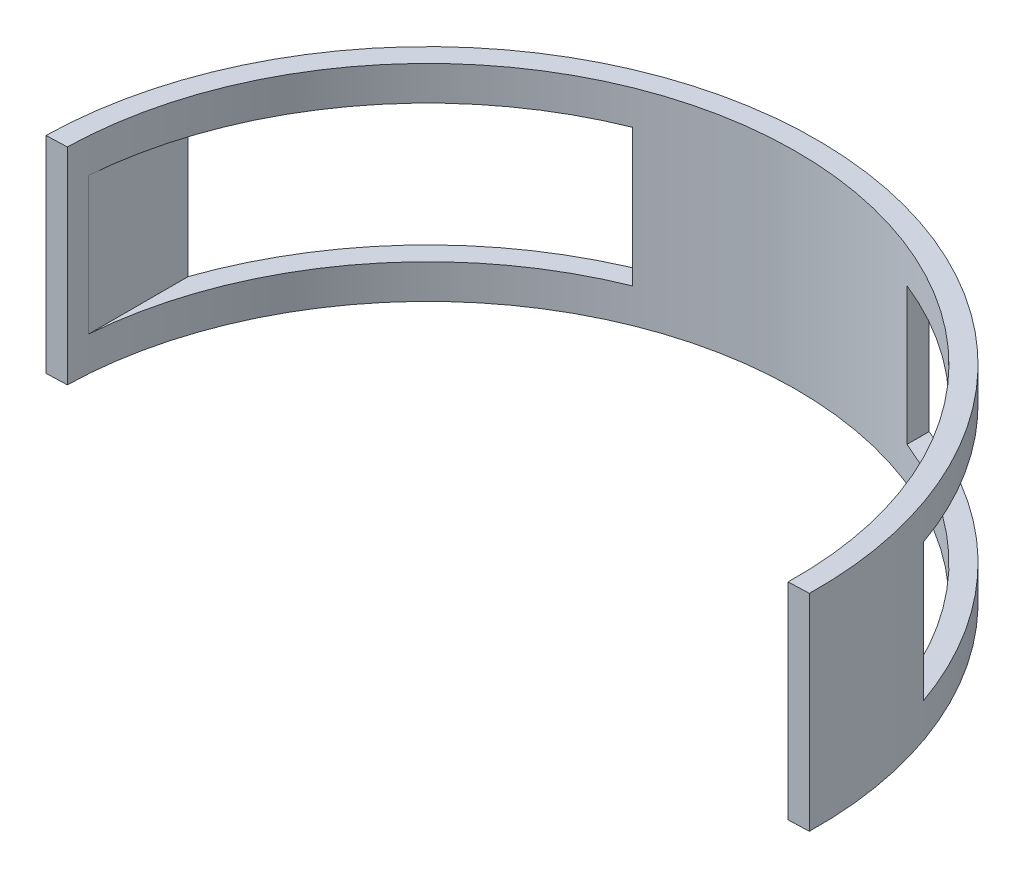
ISO-10303-21;
HEADER;
FILE_DESCRIPTION(('STEP AP214'),'2;1');
FILE_NAME('part.step','',(''),(''),'','','');
FILE_SCHEMA(('AUTOMOTIVE_DESIGN { 1 0 10303 214 1 1 1 1 }'));
ENDSEC;
DATA;
#1=APPLICATION_CONTEXT('core data for automotive mechanical design processes');
#2=APPLICATION_PROTOCOL_DEFINITION('international standard','automotive_design',2000,#1);
#3=PRODUCT_CONTEXT('',#1,'mechanical');
#4=PRODUCT('Part','Part','',(#3));
#5=PRODUCT_RELATED_PRODUCT_CATEGORY('part','',(#4));
#6=PRODUCT_DEFINITION_FORMATION('','',#4);
#7=PRODUCT_DEFINITION_CONTEXT('part definition',#1,'design');
#8=PRODUCT_DEFINITION('design','',#6,#7);
#9=PRODUCT_DEFINITION_SHAPE('','',#8);
#10=(LENGTH_UNIT() NAMED_UNIT(*) SI_UNIT(.MILLI.,.METRE.));
#11=(NAMED_UNIT(*) PLANE_ANGLE_UNIT() SI_UNIT($,.RADIAN.));
#12=(NAMED_UNIT(*) SI_UNIT($,.STERADIAN.) SOLID_ANGLE_UNIT());
#13=UNCERTAINTY_MEASURE_WITH_UNIT(LENGTH_MEASURE(1.E-05),#10,'distance_accuracy_value','');
#14=(GEOMETRIC_REPRESENTATION_CONTEXT(3) GLOBAL_UNCERTAINTY_ASSIGNED_CONTEXT((#13)) GLOBAL_UNIT_ASSIGNED_CONTEXT((#10,
#11,#12)) REPRESENTATION_CONTEXT('',''));
#15=CARTESIAN_POINT('',(0.,0.,0.));
#16=DIRECTION('',(0.,0.,1.));
#17=DIRECTION('',(1.,0.,0.));
#18=AXIS2_PLACEMENT_3D('',#15,#16,#17);
#19=CARTESIAN_POINT('',(0.,15.,0.));
#20=DIRECTION('',(0.,-1.,0.));
#21=DIRECTION('',(0.,0.,-1.));
#22=AXIS2_PLACEMENT_3D('',#19,#20,#21);
#23=CYLINDRICAL_SURFACE('',#22,56.6555359957958);
#24=CARTESIAN_POINT('',(0.,10.,0.));
#25=DIRECTION('',(0.,1.,0.));
#26=DIRECTION('',(-1.,0.,0.));
#27=AXIS2_PLACEMENT_3D('',#24,#25,#26);
#28=CIRCLE('',#27,56.6555359957958);
#29=CARTESIAN_POINT('',(-19.9754881219371,10.,-53.0172578813848));
#30=VERTEX_POINT('',#29);
#31=CARTESIAN_POINT('',(-53.5,10.,-18.6440274342995));
#32=VERTEX_POINT('',#31);
#33=EDGE_CURVE('E167',#30,#32,#28,.T.);
#34=ORIENTED_EDGE('',*,*,#33,.T.);
#35=DIRECTION('',(0.,-1.,0.));
#36=VECTOR('',#35,1.);
#37=CARTESIAN_POINT('',(-53.5,15.,-18.6440274342995));
#38=LINE('',#37,#36);
#39=CARTESIAN_POINT('',(-53.5,-10.,-18.6440274342995));
#40=VERTEX_POINT('',#39);
#41=EDGE_CURVE('E171',#32,#40,#38,.T.);
#42=ORIENTED_EDGE('',*,*,#41,.T.);
#43=CARTESIAN_POINT('',(0.,-10.,0.));
#44=DIRECTION('',(0.,-1.,0.));
#45=DIRECTION('',(0.,0.,-1.));
#46=AXIS2_PLACEMENT_3D('',#43,#44,#45);
#47=CIRCLE('',#46,56.6555359957958);
#48=CARTESIAN_POINT('',(-19.9754881219371,-10.,-53.0172578813848));
#49=VERTEX_POINT('',#48);
#50=EDGE_CURVE('E154',#40,#49,#47,.T.);
#51=ORIENTED_EDGE('',*,*,#50,.T.);
#52=DIRECTION('',(0.,-1.,0.));
#53=VECTOR('',#52,1.);
#54=CARTESIAN_POINT('',(-19.9754881219371,15.,-53.0172578813848));
#55=LINE('',#54,#53);
#56=EDGE_CURVE('E159',#49,#30,#55,.F.);
#57=ORIENTED_EDGE('',*,*,#56,.T.);
#58=EDGE_LOOP('',(#34,#42,#51,#57));
#59=FACE_BOUND('',#58,.T.);
#60=DIRECTION('',(0.,-1.,0.));
#61=VECTOR('',#60,1.);
#62=CARTESIAN_POINT('',(53.5,15.,-18.6440274342994));
#63=LINE('',#62,#61);
#64=CARTESIAN_POINT('',(53.5,-10.,-18.6440274342994));
#65=VERTEX_POINT('',#64);
#66=CARTESIAN_POINT('',(53.5,10.,-18.6440274342994));
#67=VERTEX_POINT('',#66);
#68=EDGE_CURVE('E152',#65,#67,#63,.F.);
#69=ORIENTED_EDGE('',*,*,#68,.T.);
#70=CARTESIAN_POINT('',(0.,10.,0.));
#71=DIRECTION('',(0.,1.,0.));
#72=DIRECTION('',(-1.,0.,0.));
#73=AXIS2_PLACEMENT_3D('',#70,#71,#72);
#74=CIRCLE('',#73,56.6555359957958);
#75=CARTESIAN_POINT('',(19.9754881219371,10.,-53.0172578813848));
#76=VERTEX_POINT('',#75);
#77=EDGE_CURVE('E143',#67,#76,#74,.T.);
#78=ORIENTED_EDGE('',*,*,#77,.T.);
#79=DIRECTION('',(0.,-1.,0.));
#80=VECTOR('',#79,1.);
#81=CARTESIAN_POINT('',(19.9754881219371,15.,-53.0172578813848));
#82=LINE('',#81,#80);
#83=CARTESIAN_POINT('',(19.9754881219371,-10.,-53.0172578813848));
#84=VERTEX_POINT('',#83);
#85=EDGE_CURVE('E128',#76,#84,#82,.T.);
#86=ORIENTED_EDGE('',*,*,#85,.T.);
#87=CARTESIAN_POINT('',(0.,-10.,0.));
#88=DIRECTION('',(0.,-1.,0.));
#89=DIRECTION('',(0.,0.,-1.));
#90=AXIS2_PLACEMENT_3D('',#87,#88,#89);
#91=CIRCLE('',#90,56.6555359957958);
#92=EDGE_CURVE('E137',#84,#65,#91,.T.);
#93=ORIENTED_EDGE('',*,*,#92,.T.);
#94=EDGE_LOOP('',(#69,#78,#86,#93));
#95=FACE_BOUND('',#94,.T.);
#96=CARTESIAN_POINT('',(0.,-15.,0.));
#97=DIRECTION('',(0.,1.,0.));
#98=DIRECTION('',(0.,0.,1.));
#99=AXIS2_PLACEMENT_3D('',#96,#97,#98);
#100=CIRCLE('',#99,56.6555359957958);
#101=CARTESIAN_POINT('',(56.6451469113242,-15.,1.0849379546368));
#102=VERTEX_POINT('',#101);
#103=CARTESIAN_POINT('',(-56.6451423998593,-15.,-1.08517347487532));
#104=VERTEX_POINT('',#103);
#105=EDGE_CURVE('E175',#102,#104,#100,.T.);
#106=ORIENTED_EDGE('',*,*,#105,.T.);
#107=DIRECTION('',(0.,-1.,0.));
#108=VECTOR('',#107,1.);
#109=CARTESIAN_POINT('',(-56.6451423998593,15.,-1.08517347487532));
#110=LINE('',#109,#108);
#111=CARTESIAN_POINT('',(-56.6451423998593,15.,-1.08517347487532));
#112=VERTEX_POINT('',#111);
#113=EDGE_CURVE('E213',#112,#104,#110,.T.);
#114=ORIENTED_EDGE('',*,*,#113,.F.);
#115=CARTESIAN_POINT('',(0.,15.,0.));
#116=DIRECTION('',(0.,1.,0.));
#117=DIRECTION('',(0.,0.,1.));
#118=AXIS2_PLACEMENT_3D('',#115,#116,#117);
#119=CIRCLE('',#118,56.6555359957958);
#120=CARTESIAN_POINT('',(56.6451469113242,15.,1.0849379546368));
#121=VERTEX_POINT('',#120);
#122=EDGE_CURVE('E176',#121,#112,#119,.T.);
#123=ORIENTED_EDGE('',*,*,#122,.F.);
#124=DIRECTION('',(0.,-1.,0.));
#125=VECTOR('',#124,1.);
#126=CARTESIAN_POINT('',(56.6451469113242,15.,1.0849379546368));
#127=LINE('',#126,#125);
#128=EDGE_CURVE('E190',#121,#102,#127,.T.);
#129=ORIENTED_EDGE('',*,*,#128,.T.);
#130=EDGE_LOOP('',(#106,#114,#123,#129));
#131=FACE_BOUND('',#130,.T.);
#132=ADVANCED_FACE('F41',(#59,#95,#131),#23,.T.);
#133=CARTESIAN_POINT('',(-56.6451423998593,15.,-1.08517347487532));
#134=DIRECTION('',(-0.0338603424814454,0.,-0.999426574194943));
#135=DIRECTION('',(-0.999426574194943,0.,0.0338603424814454));
#136=AXIS2_PLACEMENT_3D('',#133,#134,#135);
#137=PLANE('',#136);
#138=DIRECTION('',(0.999426574194943,0.,-0.0338603424814454));
#139=VECTOR('',#138,1.);
#140=CARTESIAN_POINT('',(-56.6451423998593,-15.,-1.08517347487532));
#141=LINE('',#140,#139);
#142=CARTESIAN_POINT('',(-53.6468751630069,-15.,-1.18675407930591));
#143=VERTEX_POINT('',#142);
#144=EDGE_CURVE('E194',#104,#143,#141,.T.);
#145=ORIENTED_EDGE('',*,*,#144,.T.);
#146=DIRECTION('',(0.,-1.,0.));
#147=VECTOR('',#146,1.);
#148=CARTESIAN_POINT('',(-53.6468751630069,15.,-1.18675407930591));
#149=LINE('',#148,#147);
#150=CARTESIAN_POINT('',(-53.6468751630069,15.,-1.18675407930591));
#151=VERTEX_POINT('',#150);
#152=EDGE_CURVE('E209',#151,#143,#149,.T.);
#153=ORIENTED_EDGE('',*,*,#152,.F.);
#154=DIRECTION('',(0.999426574194943,0.,-0.0338603424814454));
#155=VECTOR('',#154,1.);
#156=CARTESIAN_POINT('',(-56.6451423998593,15.,-1.08517347487532));
#157=LINE('',#156,#155);
#158=EDGE_CURVE('E180',#112,#151,#157,.T.);
#159=ORIENTED_EDGE('',*,*,#158,.F.);
#160=ORIENTED_EDGE('',*,*,#113,.T.);
#161=EDGE_LOOP('',(#145,#153,#159,#160));
#162=FACE_BOUND('',#161,.T.);
#163=ADVANCED_FACE('F280',(#162),#137,.F.);
#164=CARTESIAN_POINT('',(0.,15.,0.));
#165=DIRECTION('',(0.,-1.,0.));
#166=DIRECTION('',(0.,0.,-1.));
#167=AXIS2_PLACEMENT_3D('',#164,#165,#166);
#168=CYLINDRICAL_SURFACE('',#167,53.66);
#169=CARTESIAN_POINT('',(0.,-10.,0.));
#170=DIRECTION('',(0.,-1.,0.));
#171=DIRECTION('',(0.,0.,-1.));
#172=AXIS2_PLACEMENT_3D('',#169,#170,#171);
#173=CIRCLE('',#172,53.66);
#174=CARTESIAN_POINT('',(-19.9754881219371,-10.,-49.8033681018699));
#175=VERTEX_POINT('',#174);
#176=CARTESIAN_POINT('',(-53.5,-10.,-4.1407245742745));
#177=VERTEX_POINT('',#176);
#178=EDGE_CURVE('E230',#175,#177,#173,.F.);
#179=ORIENTED_EDGE('',*,*,#178,.T.);
#180=DIRECTION('',(0.,-1.,0.));
#181=VECTOR('',#180,1.);
#182=CARTESIAN_POINT('',(-53.5,15.,-4.1407245742745));
#183=LINE('',#182,#181);
#184=CARTESIAN_POINT('',(-53.5,10.,-4.1407245742745));
#185=VERTEX_POINT('',#184);
#186=EDGE_CURVE('E11',#177,#185,#183,.F.);
#187=ORIENTED_EDGE('',*,*,#186,.T.);
#188=CARTESIAN_POINT('',(0.,10.,0.));
#189=DIRECTION('',(0.,1.,0.));
#190=DIRECTION('',(-1.,0.,0.));
#191=AXIS2_PLACEMENT_3D('',#188,#189,#190);
#192=CIRCLE('',#191,53.66);
#193=CARTESIAN_POINT('',(-19.9754881219371,10.,-49.8033681018699));
#194=VERTEX_POINT('',#193);
#195=EDGE_CURVE('E49',#185,#194,#192,.F.);
#196=ORIENTED_EDGE('',*,*,#195,.T.);
#197=DIRECTION('',(0.,-1.,0.));
#198=VECTOR('',#197,1.);
#199=CARTESIAN_POINT('',(-19.9754881219371,15.,-49.8033681018699));
#200=LINE('',#199,#198);
#201=EDGE_CURVE('E234',#194,#175,#200,.T.);
#202=ORIENTED_EDGE('',*,*,#201,.T.);
#203=EDGE_LOOP('',(#179,#187,#196,#202));
#204=FACE_BOUND('',#203,.T.);
#205=DIRECTION('',(0.,-1.,0.));
#206=VECTOR('',#205,1.);
#207=CARTESIAN_POINT('',(19.9754881219371,15.,-49.8033681018699));
#208=LINE('',#207,#206);
#209=CARTESIAN_POINT('',(19.9754881219371,-10.,-49.8033681018699));
#210=VERTEX_POINT('',#209);
#211=CARTESIAN_POINT('',(19.9754881219371,10.,-49.8033681018699));
#212=VERTEX_POINT('',#211);
#213=EDGE_CURVE('E217',#210,#212,#208,.F.);
#214=ORIENTED_EDGE('',*,*,#213,.T.);
#215=CARTESIAN_POINT('',(0.,10.,0.));
#216=DIRECTION('',(0.,1.,0.));
#217=DIRECTION('',(-1.,0.,0.));
#218=AXIS2_PLACEMENT_3D('',#215,#216,#217);
#219=CIRCLE('',#218,53.66);
#220=CARTESIAN_POINT('',(53.5,10.,-4.14072457427434));
#221=VERTEX_POINT('',#220);
#222=EDGE_CURVE('E146',#212,#221,#219,.F.);
#223=ORIENTED_EDGE('',*,*,#222,.T.);
#224=DIRECTION('',(0.,-1.,0.));
#225=VECTOR('',#224,1.);
#226=CARTESIAN_POINT('',(53.5,15.,-4.14072457427434));
#227=LINE('',#226,#225);
#228=CARTESIAN_POINT('',(53.5,-10.,-4.14072457427434));
#229=VERTEX_POINT('',#228);
#230=EDGE_CURVE('E224',#221,#229,#227,.T.);
#231=ORIENTED_EDGE('',*,*,#230,.T.);
#232=CARTESIAN_POINT('',(0.,-10.,0.));
#233=DIRECTION('',(0.,-1.,0.));
#234=DIRECTION('',(0.,0.,-1.));
#235=AXIS2_PLACEMENT_3D('',#232,#233,#234);
#236=CIRCLE('',#235,53.66);
#237=EDGE_CURVE('E220',#229,#210,#236,.F.);
#238=ORIENTED_EDGE('',*,*,#237,.T.);
#239=EDGE_LOOP('',(#214,#223,#231,#238));
#240=FACE_BOUND('',#239,.T.);
#241=CARTESIAN_POINT('',(0.,-15.,0.));
#242=DIRECTION('',(0.,-1.,0.));
#243=DIRECTION('',(0.,0.,1.));
#244=AXIS2_PLACEMENT_3D('',#241,#242,#243);
#245=CIRCLE('',#244,53.66);
#246=CARTESIAN_POINT('',(53.6468751630069,-15.,1.18675407930591));
#247=VERTEX_POINT('',#246);
#248=EDGE_CURVE('E197',#143,#247,#245,.T.);
#249=ORIENTED_EDGE('',*,*,#248,.T.);
#250=DIRECTION('',(0.,-1.,0.));
#251=VECTOR('',#250,1.);
#252=CARTESIAN_POINT('',(53.6468751630069,15.,1.18675407930591));
#253=LINE('',#252,#251);
#254=CARTESIAN_POINT('',(53.6468751630069,15.,1.18675407930591));
#255=VERTEX_POINT('',#254);
#256=EDGE_CURVE('E205',#255,#247,#253,.T.);
#257=ORIENTED_EDGE('',*,*,#256,.F.);
#258=CARTESIAN_POINT('',(0.,15.,0.));
#259=DIRECTION('',(0.,-1.,0.));
#260=DIRECTION('',(0.,0.,1.));
#261=AXIS2_PLACEMENT_3D('',#258,#259,#260);
#262=CIRCLE('',#261,53.66);
#263=EDGE_CURVE('E184',#151,#255,#262,.T.);
#264=ORIENTED_EDGE('',*,*,#263,.F.);
#265=ORIENTED_EDGE('',*,*,#152,.T.);
#266=EDGE_LOOP('',(#249,#257,#264,#265));
#267=FACE_BOUND('',#266,.T.);
#268=ADVANCED_FACE('F240',(#204,#240,#267),#168,.F.);
#269=CARTESIAN_POINT('',(53.6468751630069,15.,1.18675407930591));
#270=DIRECTION('',(-0.0339387082230345,0.,-0.999423916105749));
#271=DIRECTION('',(-0.999423916105749,0.,0.0339387082230345));
#272=AXIS2_PLACEMENT_3D('',#269,#270,#271);
#273=PLANE('',#272);
#274=DIRECTION('',(0.999423916105749,0.,-0.0339387082230345));
#275=VECTOR('',#274,1.);
#276=CARTESIAN_POINT('',(53.6468751630069,-15.,1.18675407930591));
#277=LINE('',#276,#275);
#278=EDGE_CURVE('E181',#247,#102,#277,.T.);
#279=ORIENTED_EDGE('',*,*,#278,.T.);
#280=ORIENTED_EDGE('',*,*,#128,.F.);
#281=DIRECTION('',(0.999423916105749,0.,-0.0339387082230345));
#282=VECTOR('',#281,1.);
#283=CARTESIAN_POINT('',(53.6468751630069,15.,1.18675407930591));
#284=LINE('',#283,#282);
#285=EDGE_CURVE('E187',#255,#121,#284,.T.);
#286=ORIENTED_EDGE('',*,*,#285,.F.);
#287=ORIENTED_EDGE('',*,*,#256,.T.);
#288=EDGE_LOOP('',(#279,#280,#286,#287));
#289=FACE_BOUND('',#288,.T.);
#290=ADVANCED_FACE('F279',(#289),#273,.F.);
#291=CARTESIAN_POINT('',(0.,15.,0.));
#292=DIRECTION('',(0.,1.,0.));
#293=DIRECTION('',(0.,0.,1.));
#294=AXIS2_PLACEMENT_3D('',#291,#292,#293);
#295=PLANE('',#294);
#296=ORIENTED_EDGE('',*,*,#122,.T.);
#297=ORIENTED_EDGE('',*,*,#158,.T.);
#298=ORIENTED_EDGE('',*,*,#263,.T.);
#299=ORIENTED_EDGE('',*,*,#285,.T.);
#300=EDGE_LOOP('',(#296,#297,#298,#299));
#301=FACE_BOUND('',#300,.T.);
#302=ADVANCED_FACE('F296',(#301),#295,.T.);
#303=CARTESIAN_POINT('',(0.,-15.,0.));
#304=DIRECTION('',(0.,1.,0.));
#305=DIRECTION('',(0.,0.,1.));
#306=AXIS2_PLACEMENT_3D('',#303,#304,#305);
#307=PLANE('',#306);
#308=ORIENTED_EDGE('',*,*,#105,.F.);
#309=ORIENTED_EDGE('',*,*,#278,.F.);
#310=ORIENTED_EDGE('',*,*,#248,.F.);
#311=ORIENTED_EDGE('',*,*,#144,.F.);
#312=EDGE_LOOP('',(#308,#309,#310,#311));
#313=FACE_BOUND('',#312,.T.);
#314=ADVANCED_FACE('F292',(#313),#307,.F.);
#315=CARTESIAN_POINT('',(19.9754881219371,10.,-200.));
#316=DIRECTION('',(0.,1.,0.));
#317=DIRECTION('',(-1.,0.,0.));
#318=AXIS2_PLACEMENT_3D('',#315,#316,#317);
#319=PLANE('',#318);
#320=DIRECTION('',(0.,0.,1.));
#321=VECTOR('',#320,1.);
#322=CARTESIAN_POINT('',(53.5,10.,-200.));
#323=LINE('',#322,#321);
#324=EDGE_CURVE('E263',#67,#221,#323,.T.);
#325=ORIENTED_EDGE('',*,*,#324,.T.);
#326=ORIENTED_EDGE('',*,*,#222,.F.);
#327=DIRECTION('',(0.,0.,1.));
#328=VECTOR('',#327,1.);
#329=CARTESIAN_POINT('',(19.9754881219371,10.,-200.));
#330=LINE('',#329,#328);
#331=EDGE_CURVE('E131',#76,#212,#330,.T.);
#332=ORIENTED_EDGE('',*,*,#331,.F.);
#333=ORIENTED_EDGE('',*,*,#77,.F.);
#334=EDGE_LOOP('',(#325,#326,#332,#333));
#335=FACE_BOUND('',#334,.T.);
#336=ADVANCED_FACE('F142',(#335),#319,.F.);
#337=CARTESIAN_POINT('',(53.5,10.,-200.));
#338=DIRECTION('',(1.,0.,0.));
#339=DIRECTION('',(0.,0.,-1.));
#340=AXIS2_PLACEMENT_3D('',#337,#338,#339);
#341=PLANE('',#340);
#342=DIRECTION('',(0.,0.,1.));
#343=VECTOR('',#342,1.);
#344=CARTESIAN_POINT('',(53.5,-10.,-200.));
#345=LINE('',#344,#343);
#346=EDGE_CURVE('E266',#65,#229,#345,.T.);
#347=ORIENTED_EDGE('',*,*,#346,.T.);
#348=ORIENTED_EDGE('',*,*,#230,.F.);
#349=ORIENTED_EDGE('',*,*,#324,.F.);
#350=ORIENTED_EDGE('',*,*,#68,.F.);
#351=EDGE_LOOP('',(#347,#348,#349,#350));
#352=FACE_BOUND('',#351,.T.);
#353=ADVANCED_FACE('F276',(#352),#341,.F.);
#354=CARTESIAN_POINT('',(53.5,-10.,-200.));
#355=DIRECTION('',(0.,-1.,0.));
#356=DIRECTION('',(0.,0.,-1.));
#357=AXIS2_PLACEMENT_3D('',#354,#355,#356);
#358=PLANE('',#357);
#359=DIRECTION('',(0.,0.,1.));
#360=VECTOR('',#359,1.);
#361=CARTESIAN_POINT('',(19.9754881219371,-10.,-200.));
#362=LINE('',#361,#360);
#363=EDGE_CURVE('E64',#84,#210,#362,.T.);
#364=ORIENTED_EDGE('',*,*,#363,.T.);
#365=ORIENTED_EDGE('',*,*,#237,.F.);
#366=ORIENTED_EDGE('',*,*,#346,.F.);
#367=ORIENTED_EDGE('',*,*,#92,.F.);
#368=EDGE_LOOP('',(#364,#365,#366,#367));
#369=FACE_BOUND('',#368,.T.);
#370=ADVANCED_FACE('F274',(#369),#358,.F.);
#371=CARTESIAN_POINT('',(19.9754881219371,-10.,-200.));
#372=DIRECTION('',(-1.,0.,0.));
#373=DIRECTION('',(0.,0.,1.));
#374=AXIS2_PLACEMENT_3D('',#371,#372,#373);
#375=PLANE('',#374);
#376=ORIENTED_EDGE('',*,*,#331,.T.);
#377=ORIENTED_EDGE('',*,*,#213,.F.);
#378=ORIENTED_EDGE('',*,*,#363,.F.);
#379=ORIENTED_EDGE('',*,*,#85,.F.);
#380=EDGE_LOOP('',(#376,#377,#378,#379));
#381=FACE_BOUND('',#380,.T.);
#382=ADVANCED_FACE('F130',(#381),#375,.F.);
#383=CARTESIAN_POINT('',(-53.5,-10.,-200.));
#384=DIRECTION('',(-1.,0.,0.));
#385=DIRECTION('',(0.,0.,1.));
#386=AXIS2_PLACEMENT_3D('',#383,#384,#385);
#387=PLANE('',#386);
#388=DIRECTION('',(0.,0.,1.));
#389=VECTOR('',#388,1.);
#390=CARTESIAN_POINT('',(-53.5,10.,-200.));
#391=LINE('',#390,#389);
#392=EDGE_CURVE('E138',#32,#185,#391,.T.);
#393=ORIENTED_EDGE('',*,*,#392,.T.);
#394=ORIENTED_EDGE('',*,*,#186,.F.);
#395=DIRECTION('',(0.,0.,1.));
#396=VECTOR('',#395,1.);
#397=CARTESIAN_POINT('',(-53.5,-10.,-200.));
#398=LINE('',#397,#396);
#399=EDGE_CURVE('E260',#40,#177,#398,.T.);
#400=ORIENTED_EDGE('',*,*,#399,.F.);
#401=ORIENTED_EDGE('',*,*,#41,.F.);
#402=EDGE_LOOP('',(#393,#394,#400,#401));
#403=FACE_BOUND('',#402,.T.);
#404=ADVANCED_FACE('F251',(#403),#387,.F.);
#405=CARTESIAN_POINT('',(-53.5,10.,-200.));
#406=DIRECTION('',(0.,1.,0.));
#407=DIRECTION('',(-1.,0.,0.));
#408=AXIS2_PLACEMENT_3D('',#405,#406,#407);
#409=PLANE('',#408);
#410=DIRECTION('',(0.,0.,1.));
#411=VECTOR('',#410,1.);
#412=CARTESIAN_POINT('',(-19.9754881219371,10.,-200.));
#413=LINE('',#412,#411);
#414=EDGE_CURVE('E249',#30,#194,#413,.T.);
#415=ORIENTED_EDGE('',*,*,#414,.T.);
#416=ORIENTED_EDGE('',*,*,#195,.F.);
#417=ORIENTED_EDGE('',*,*,#392,.F.);
#418=ORIENTED_EDGE('',*,*,#33,.F.);
#419=EDGE_LOOP('',(#415,#416,#417,#418));
#420=FACE_BOUND('',#419,.T.);
#421=ADVANCED_FACE('F247',(#420),#409,.F.);
#422=CARTESIAN_POINT('',(-19.9754881219371,10.,-200.));
#423=DIRECTION('',(1.,0.,0.));
#424=DIRECTION('',(0.,0.,-1.));
#425=AXIS2_PLACEMENT_3D('',#422,#423,#424);
#426=PLANE('',#425);
#427=DIRECTION('',(0.,0.,1.));
#428=VECTOR('',#427,1.);
#429=CARTESIAN_POINT('',(-19.9754881219371,-10.,-200.));
#430=LINE('',#429,#428);
#431=EDGE_CURVE('E56',#49,#175,#430,.T.);
#432=ORIENTED_EDGE('',*,*,#431,.T.);
#433=ORIENTED_EDGE('',*,*,#201,.F.);
#434=ORIENTED_EDGE('',*,*,#414,.F.);
#435=ORIENTED_EDGE('',*,*,#56,.F.);
#436=EDGE_LOOP('',(#432,#433,#434,#435));
#437=FACE_BOUND('',#436,.T.);
#438=ADVANCED_FACE('F323',(#437),#426,.F.);
#439=CARTESIAN_POINT('',(-19.9754881219371,-10.,-200.));
#440=DIRECTION('',(0.,-1.,0.));
#441=DIRECTION('',(0.,0.,-1.));
#442=AXIS2_PLACEMENT_3D('',#439,#440,#441);
#443=PLANE('',#442);
#444=ORIENTED_EDGE('',*,*,#399,.T.);
#445=ORIENTED_EDGE('',*,*,#178,.F.);
#446=ORIENTED_EDGE('',*,*,#431,.F.);
#447=ORIENTED_EDGE('',*,*,#50,.F.);
#448=EDGE_LOOP('',(#444,#445,#446,#447));
#449=FACE_BOUND('',#448,.T.);
#450=ADVANCED_FACE('F320',(#449),#443,.F.);
#451=CLOSED_SHELL('',(#132,#163,#268,#290,#302,#314,#336,#353,#370,#382,#404,#421,#438,#450));
#452=MANIFOLD_SOLID_BREP('B2',#451);
#453=ADVANCED_BREP_SHAPE_REPRESENTATION('',(#18,#452),#14);
#454=SHAPE_DEFINITION_REPRESENTATION(#9,#453);
ENDSEC;
END-ISO-10303-21;
